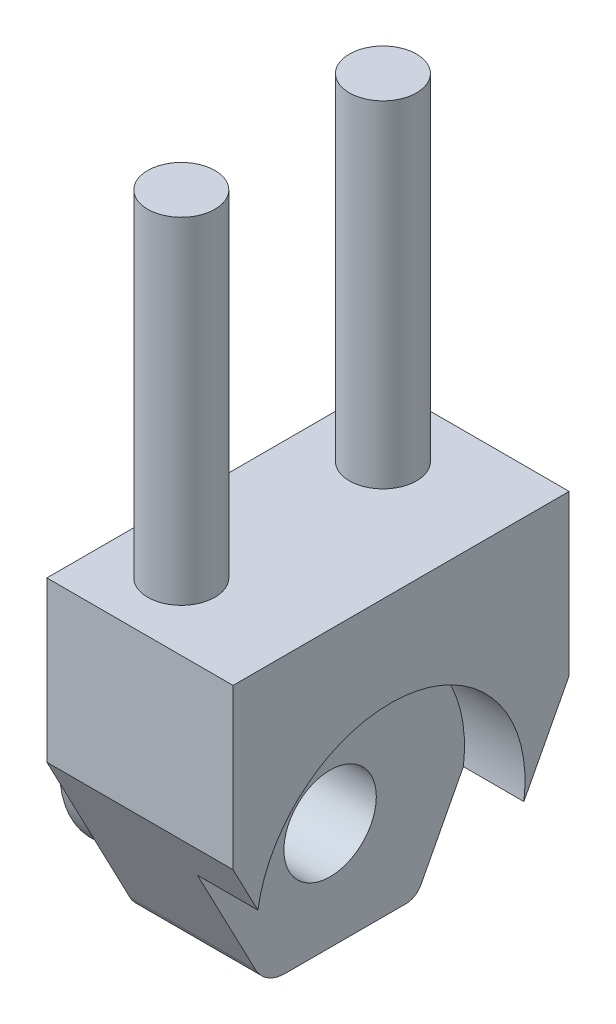
ISO-10303-21;
HEADER;
FILE_DESCRIPTION(('STEP AP214'),'2;1');
FILE_NAME('part.step','',(''),(''),'','','');
FILE_SCHEMA(('AUTOMOTIVE_DESIGN { 1 0 10303 214 1 1 1 1 }'));
ENDSEC;
DATA;
#1=APPLICATION_CONTEXT('core data for automotive mechanical design processes');
#2=APPLICATION_PROTOCOL_DEFINITION('international standard','automotive_design',2000,#1);
#3=PRODUCT_CONTEXT('',#1,'mechanical');
#4=PRODUCT('Part','Part','',(#3));
#5=PRODUCT_RELATED_PRODUCT_CATEGORY('part','',(#4));
#6=PRODUCT_DEFINITION_FORMATION('','',#4);
#7=PRODUCT_DEFINITION_CONTEXT('part definition',#1,'design');
#8=PRODUCT_DEFINITION('design','',#6,#7);
#9=PRODUCT_DEFINITION_SHAPE('','',#8);
#10=(LENGTH_UNIT() NAMED_UNIT(*) SI_UNIT(.MILLI.,.METRE.));
#11=(NAMED_UNIT(*) PLANE_ANGLE_UNIT() SI_UNIT($,.RADIAN.));
#12=(NAMED_UNIT(*) SI_UNIT($,.STERADIAN.) SOLID_ANGLE_UNIT());
#13=UNCERTAINTY_MEASURE_WITH_UNIT(LENGTH_MEASURE(1.E-05),#10,'distance_accuracy_value','');
#14=(GEOMETRIC_REPRESENTATION_CONTEXT(3) GLOBAL_UNCERTAINTY_ASSIGNED_CONTEXT((#13)) GLOBAL_UNIT_ASSIGNED_CONTEXT((#10,
#11,#12)) REPRESENTATION_CONTEXT('',''));
#15=CARTESIAN_POINT('',(0.,0.,0.));
#16=DIRECTION('',(0.,0.,1.));
#17=DIRECTION('',(1.,0.,0.));
#18=AXIS2_PLACEMENT_3D('',#15,#16,#17);
#19=CARTESIAN_POINT('',(30.7741068663053,12.8,1.61793004647283));
#20=DIRECTION('',(1.,0.,0.));
#21=DIRECTION('',(0.,0.,-1.));
#22=AXIS2_PLACEMENT_3D('',#19,#20,#21);
#23=PLANE('',#22);
#24=DIRECTION('',(0.,0.,-1.));
#25=VECTOR('',#24,1.);
#26=CARTESIAN_POINT('',(30.7741068663053,0.,0.));
#27=LINE('',#26,#25);
#28=CARTESIAN_POINT('',(30.7741068663053,0.,6.94763686889959));
#29=VERTEX_POINT('',#28);
#30=CARTESIAN_POINT('',(30.7741068663053,0.,-7.42192336474054));
#31=VERTEX_POINT('',#30);
#32=EDGE_CURVE('E177',#29,#31,#27,.T.);
#33=ORIENTED_EDGE('',*,*,#32,.T.);
#34=CARTESIAN_POINT('',(30.7741068663053,2.,-7.42192336474054));
#35=DIRECTION('',(1.,0.,0.));
#36=DIRECTION('',(0.,0.,-1.));
#37=AXIS2_PLACEMENT_3D('',#34,#35,#36);
#38=CIRCLE('',#37,2.);
#39=CARTESIAN_POINT('',(30.7741068663053,1.07198601065888,-9.19358643530085));
#40=VERTEX_POINT('',#39);
#41=EDGE_CURVE('E58',#31,#40,#38,.T.);
#42=ORIENTED_EDGE('',*,*,#41,.T.);
#43=DIRECTION('',(0.,0.885831535280156,-0.464006994670556));
#44=VECTOR('',#43,1.);
#45=CARTESIAN_POINT('',(30.7741068663053,21.0000000000001,-19.6320699535272));
#46=LINE('',#45,#44);
#47=CARTESIAN_POINT('',(30.7741068663053,10.7174168179879,-14.2459549534255));
#48=VERTEX_POINT('',#47);
#49=EDGE_CURVE('E132',#48,#40,#46,.F.);
#50=ORIENTED_EDGE('',*,*,#49,.F.);
#51=CARTESIAN_POINT('',(30.7741068663053,12.8,1.61793004647283));
#52=DIRECTION('',(1.,0.,0.));
#53=DIRECTION('',(0.,0.,-1.));
#54=AXIS2_PLACEMENT_3D('',#51,#52,#53);
#55=CIRCLE('',#54,16.);
#56=CARTESIAN_POINT('',(30.7741068663053,15.3573140445786,17.4122374031568));
#57=VERTEX_POINT('',#56);
#58=EDGE_CURVE('E121',#48,#57,#55,.T.);
#59=ORIENTED_EDGE('',*,*,#58,.T.);
#60=DIRECTION('',(0.,-0.885831535280157,-0.464006994670556));
#61=VECTOR('',#60,1.);
#62=CARTESIAN_POINT('',(30.7741068663053,21.0000000000001,20.3679300464728));
#63=LINE('',#62,#61);
#64=CARTESIAN_POINT('',(30.7741068663053,2.14397202131778,10.4909630100202));
#65=VERTEX_POINT('',#64);
#66=EDGE_CURVE('E130',#65,#57,#63,.F.);
#67=ORIENTED_EDGE('',*,*,#66,.F.);
#68=CARTESIAN_POINT('',(30.7741068663053,4.,6.94763686889959));
#69=DIRECTION('',(1.,0.,0.));
#70=DIRECTION('',(0.,0.,-1.));
#71=AXIS2_PLACEMENT_3D('',#68,#69,#70);
#72=CIRCLE('',#71,4.);
#73=EDGE_CURVE('E164',#29,#65,#72,.F.);
#74=ORIENTED_EDGE('',*,*,#73,.F.);
#75=EDGE_LOOP('',(#33,#42,#50,#59,#67,#74));
#76=FACE_BOUND('',#75,.T.);
#77=CARTESIAN_POINT('',(30.7741068663053,12.8,1.61793004647283));
#78=DIRECTION('',(1.,0.,0.));
#79=DIRECTION('',(0.,0.,-1.));
#80=AXIS2_PLACEMENT_3D('',#77,#78,#79);
#81=CIRCLE('',#80,5.5);
#82=CARTESIAN_POINT('',(30.7741068663053,12.8,-3.88206995352717));
#83=VERTEX_POINT('',#82);
#84=EDGE_CURVE('E39',#83,#83,#81,.F.);
#85=ORIENTED_EDGE('',*,*,#84,.T.);
#86=EDGE_LOOP('',(#85));
#87=FACE_BOUND('',#86,.T.);
#88=ADVANCED_FACE('F35',(#76,#87),#23,.T.);
#89=CARTESIAN_POINT('',(0.,0.,0.));
#90=DIRECTION('',(0.,1.,0.));
#91=DIRECTION('',(0.,0.,1.));
#92=AXIS2_PLACEMENT_3D('',#89,#90,#91);
#93=PLANE('',#92);
#94=DIRECTION('',(0.,0.,1.));
#95=VECTOR('',#94,1.);
#96=CARTESIAN_POINT('',(15.8141068663053,0.,-19.6320699535272));
#97=LINE('',#96,#95);
#98=CARTESIAN_POINT('',(15.8141068663053,0.,-7.42192336474054));
#99=VERTEX_POINT('',#98);
#100=CARTESIAN_POINT('',(15.8141068663053,0.,6.94763686889959));
#101=VERTEX_POINT('',#100);
#102=EDGE_CURVE('E179',#99,#101,#97,.T.);
#103=ORIENTED_EDGE('',*,*,#102,.F.);
#104=DIRECTION('',(-1.,0.,0.));
#105=VECTOR('',#104,1.);
#106=CARTESIAN_POINT('',(30.7741068663053,0.,-7.42192336474054));
#107=LINE('',#106,#105);
#108=EDGE_CURVE('E168',#99,#31,#107,.F.);
#109=ORIENTED_EDGE('',*,*,#108,.T.);
#110=ORIENTED_EDGE('',*,*,#32,.F.);
#111=DIRECTION('',(1.,0.,0.));
#112=VECTOR('',#111,1.);
#113=CARTESIAN_POINT('',(15.8141068663053,0.,6.94763686889959));
#114=LINE('',#113,#112);
#115=EDGE_CURVE('E154',#29,#101,#114,.F.);
#116=ORIENTED_EDGE('',*,*,#115,.T.);
#117=EDGE_LOOP('',(#103,#109,#110,#116));
#118=FACE_BOUND('',#117,.T.);
#119=ADVANCED_FACE('F176',(#118),#93,.F.);
#120=CARTESIAN_POINT('',(15.8141068663053,21.0000000000001,-19.6320699535272));
#121=DIRECTION('',(0.,0.464006994670556,0.885831535280156));
#122=DIRECTION('',(-1.,0.,0.));
#123=AXIS2_PLACEMENT_3D('',#120,#121,#122);
#124=PLANE('',#123);
#125=ORIENTED_EDGE('',*,*,#49,.T.);
#126=DIRECTION('',(1.,0.,0.));
#127=VECTOR('',#126,1.);
#128=CARTESIAN_POINT('',(15.8141068663053,1.07198601065889,-9.19358643530085));
#129=LINE('',#128,#127);
#130=CARTESIAN_POINT('',(15.8141068663053,1.07198601065888,-9.19358643530085));
#131=VERTEX_POINT('',#130);
#132=EDGE_CURVE('E44',#40,#131,#129,.F.);
#133=ORIENTED_EDGE('',*,*,#132,.T.);
#134=DIRECTION('',(0.,0.885831535280156,-0.464006994670556));
#135=VECTOR('',#134,1.);
#136=CARTESIAN_POINT('',(15.8141068663053,21.0000000000001,-19.6320699535272));
#137=LINE('',#136,#135);
#138=CARTESIAN_POINT('',(15.8141068663053,21.0000000000001,-19.6320699535272));
#139=VERTEX_POINT('',#138);
#140=EDGE_CURVE('E150',#139,#131,#137,.F.);
#141=ORIENTED_EDGE('',*,*,#140,.F.);
#142=DIRECTION('',(-1.,0.,0.));
#143=VECTOR('',#142,1.);
#144=CARTESIAN_POINT('',(15.8141068663053,21.0000000000001,-19.6320699535272));
#145=LINE('',#144,#143);
#146=CARTESIAN_POINT('',(37.9741068663053,21.0000000000001,-19.6320699535272));
#147=VERTEX_POINT('',#146);
#148=EDGE_CURVE('E142',#147,#139,#145,.T.);
#149=ORIENTED_EDGE('',*,*,#148,.F.);
#150=DIRECTION('',(0.,-0.885831535280156,0.464006994670556));
#151=VECTOR('',#150,1.);
#152=CARTESIAN_POINT('',(37.9741068663053,21.0000000000001,-19.6320699535272));
#153=LINE('',#152,#151);
#154=CARTESIAN_POINT('',(37.9741068663053,10.7174168179879,-14.2459549534255));
#155=VERTEX_POINT('',#154);
#156=EDGE_CURVE('E152',#155,#147,#153,.F.);
#157=ORIENTED_EDGE('',*,*,#156,.F.);
#158=DIRECTION('',(1.,0.,0.));
#159=VECTOR('',#158,1.);
#160=CARTESIAN_POINT('',(30.7741068663053,10.7174168179879,-14.2459549534255));
#161=LINE('',#160,#159);
#162=EDGE_CURVE('E117',#48,#155,#161,.T.);
#163=ORIENTED_EDGE('',*,*,#162,.F.);
#164=EDGE_LOOP('',(#125,#133,#141,#149,#157,#163));
#165=FACE_BOUND('',#164,.T.);
#166=ADVANCED_FACE('F246',(#165),#124,.F.);
#167=CARTESIAN_POINT('',(37.9741068663053,40.,-19.6320699535272));
#168=DIRECTION('',(-1.,0.,0.));
#169=DIRECTION('',(0.,0.,1.));
#170=AXIS2_PLACEMENT_3D('',#167,#168,#169);
#171=PLANE('',#170);
#172=DIRECTION('',(0.,0.885831535280157,0.464006994670556));
#173=VECTOR('',#172,1.);
#174=CARTESIAN_POINT('',(37.9741068663053,21.0000000000001,20.3679300464728));
#175=LINE('',#174,#173);
#176=CARTESIAN_POINT('',(37.9741068663053,21.0000000000002,20.3679300464728));
#177=VERTEX_POINT('',#176);
#178=CARTESIAN_POINT('',(37.9741068663053,15.3573140445786,17.4122374031568));
#179=VERTEX_POINT('',#178);
#180=EDGE_CURVE('E127',#177,#179,#175,.F.);
#181=ORIENTED_EDGE('',*,*,#180,.T.);
#182=CARTESIAN_POINT('',(37.9741068663053,12.8,1.61793004647283));
#183=DIRECTION('',(1.,0.,0.));
#184=DIRECTION('',(0.,0.,-1.));
#185=AXIS2_PLACEMENT_3D('',#182,#183,#184);
#186=CIRCLE('',#185,16.);
#187=EDGE_CURVE('E110',#155,#179,#186,.T.);
#188=ORIENTED_EDGE('',*,*,#187,.F.);
#189=ORIENTED_EDGE('',*,*,#156,.T.);
#190=DIRECTION('',(0.,-1.,0.));
#191=VECTOR('',#190,1.);
#192=CARTESIAN_POINT('',(37.9741068663053,40.,-19.6320699535272));
#193=LINE('',#192,#191);
#194=CARTESIAN_POINT('',(37.9741068663053,40.,-19.6320699535272));
#195=VERTEX_POINT('',#194);
#196=EDGE_CURVE('E214',#195,#147,#193,.T.);
#197=ORIENTED_EDGE('',*,*,#196,.F.);
#198=DIRECTION('',(0.,0.,-1.));
#199=VECTOR('',#198,1.);
#200=CARTESIAN_POINT('',(37.9741068663053,40.,-19.6320699535272));
#201=LINE('',#200,#199);
#202=CARTESIAN_POINT('',(37.9741068663053,40.,20.3679300464728));
#203=VERTEX_POINT('',#202);
#204=EDGE_CURVE('E206',#203,#195,#201,.T.);
#205=ORIENTED_EDGE('',*,*,#204,.F.);
#206=DIRECTION('',(0.,-1.,0.));
#207=VECTOR('',#206,1.);
#208=CARTESIAN_POINT('',(37.9741068663053,40.,20.3679300464728));
#209=LINE('',#208,#207);
#210=EDGE_CURVE('E138',#203,#177,#209,.T.);
#211=ORIENTED_EDGE('',*,*,#210,.T.);
#212=EDGE_LOOP('',(#181,#188,#189,#197,#205,#211));
#213=FACE_BOUND('',#212,.T.);
#214=ADVANCED_FACE('F135',(#213),#171,.F.);
#215=CARTESIAN_POINT('',(0.,4.,6.94763686889959));
#216=DIRECTION('',(-1.,0.,0.));
#217=DIRECTION('',(0.,0.,1.));
#218=AXIS2_PLACEMENT_3D('',#215,#216,#217);
#219=CYLINDRICAL_SURFACE('',#218,4.);
#220=ORIENTED_EDGE('',*,*,#115,.F.);
#221=ORIENTED_EDGE('',*,*,#73,.T.);
#222=DIRECTION('',(-1.,0.,0.));
#223=VECTOR('',#222,1.);
#224=CARTESIAN_POINT('',(37.9741068663053,2.14397202131778,10.4909630100202));
#225=LINE('',#224,#223);
#226=CARTESIAN_POINT('',(15.8141068663053,2.14397202131777,10.4909630100202));
#227=VERTEX_POINT('',#226);
#228=EDGE_CURVE('E159',#227,#65,#225,.F.);
#229=ORIENTED_EDGE('',*,*,#228,.F.);
#230=CARTESIAN_POINT('',(15.8141068663053,4.,6.94763686889959));
#231=DIRECTION('',(1.,0.,0.));
#232=DIRECTION('',(0.,0.,-1.));
#233=AXIS2_PLACEMENT_3D('',#230,#231,#232);
#234=CIRCLE('',#233,4.);
#235=EDGE_CURVE('E157',#101,#227,#234,.F.);
#236=ORIENTED_EDGE('',*,*,#235,.F.);
#237=EDGE_LOOP('',(#220,#221,#229,#236));
#238=FACE_BOUND('',#237,.T.);
#239=ADVANCED_FACE('F227',(#238),#219,.T.);
#240=CARTESIAN_POINT('',(15.8141068663053,40.,-19.6320699535272));
#241=DIRECTION('',(1.,0.,0.));
#242=DIRECTION('',(0.,0.,-1.));
#243=AXIS2_PLACEMENT_3D('',#240,#241,#242);
#244=PLANE('',#243);
#245=ORIENTED_EDGE('',*,*,#140,.T.);
#246=CARTESIAN_POINT('',(15.8141068663053,2.,-7.42192336474054));
#247=DIRECTION('',(1.,0.,0.));
#248=DIRECTION('',(0.,0.,-1.));
#249=AXIS2_PLACEMENT_3D('',#246,#247,#248);
#250=CIRCLE('',#249,2.);
#251=EDGE_CURVE('E11',#131,#99,#250,.F.);
#252=ORIENTED_EDGE('',*,*,#251,.T.);
#253=ORIENTED_EDGE('',*,*,#102,.T.);
#254=ORIENTED_EDGE('',*,*,#235,.T.);
#255=DIRECTION('',(0.,-0.885831535280157,-0.464006994670556));
#256=VECTOR('',#255,1.);
#257=CARTESIAN_POINT('',(15.8141068663053,21.0000000000001,20.3679300464728));
#258=LINE('',#257,#256);
#259=CARTESIAN_POINT('',(15.8141068663053,21.0000000000002,20.3679300464728));
#260=VERTEX_POINT('',#259);
#261=EDGE_CURVE('E139',#227,#260,#258,.F.);
#262=ORIENTED_EDGE('',*,*,#261,.T.);
#263=DIRECTION('',(0.,-1.,0.));
#264=VECTOR('',#263,1.);
#265=CARTESIAN_POINT('',(15.8141068663053,40.,20.3679300464728));
#266=LINE('',#265,#264);
#267=CARTESIAN_POINT('',(15.8141068663053,40.,20.3679300464728));
#268=VERTEX_POINT('',#267);
#269=EDGE_CURVE('E144',#268,#260,#266,.T.);
#270=ORIENTED_EDGE('',*,*,#269,.F.);
#271=DIRECTION('',(0.,0.,1.));
#272=VECTOR('',#271,1.);
#273=CARTESIAN_POINT('',(15.8141068663053,40.,-19.6320699535272));
#274=LINE('',#273,#272);
#275=CARTESIAN_POINT('',(15.8141068663053,40.,-19.6320699535272));
#276=VERTEX_POINT('',#275);
#277=EDGE_CURVE('E201',#276,#268,#274,.T.);
#278=ORIENTED_EDGE('',*,*,#277,.F.);
#279=DIRECTION('',(0.,-1.,0.));
#280=VECTOR('',#279,1.);
#281=CARTESIAN_POINT('',(15.8141068663053,40.,-19.6320699535272));
#282=LINE('',#281,#280);
#283=EDGE_CURVE('E210',#276,#139,#282,.T.);
#284=ORIENTED_EDGE('',*,*,#283,.T.);
#285=EDGE_LOOP('',(#245,#252,#253,#254,#262,#270,#278,#284));
#286=FACE_BOUND('',#285,.T.);
#287=CARTESIAN_POINT('',(15.8141068663053,13.5,0.367930046472834));
#288=DIRECTION('',(1.,0.,0.));
#289=DIRECTION('',(0.,0.,-1.));
#290=AXIS2_PLACEMENT_3D('',#287,#288,#289);
#291=CIRCLE('',#290,12.5);
#292=CARTESIAN_POINT('',(15.8141068663053,13.5,-12.1320699535272));
#293=VERTEX_POINT('',#292);
#294=EDGE_CURVE('E161',#293,#293,#291,.F.);
#295=ORIENTED_EDGE('',*,*,#294,.F.);
#296=EDGE_LOOP('',(#295));
#297=FACE_BOUND('',#296,.T.);
#298=ADVANCED_FACE('F228',(#286,#297),#244,.F.);
#299=CARTESIAN_POINT('',(0.,40.,0.));
#300=DIRECTION('',(0.,1.,0.));
#301=DIRECTION('',(0.,0.,1.));
#302=AXIS2_PLACEMENT_3D('',#299,#300,#301);
#303=PLANE('',#302);
#304=CARTESIAN_POINT('',(23.8141068663053,40.,-11.6320699535272));
#305=DIRECTION('',(0.,1.,0.));
#306=DIRECTION('',(0.,0.,1.));
#307=AXIS2_PLACEMENT_3D('',#304,#305,#306);
#308=CIRCLE('',#307,4.);
#309=CARTESIAN_POINT('',(23.8141068663053,40.,-7.63206995352717));
#310=VERTEX_POINT('',#309);
#311=EDGE_CURVE('E193',#310,#310,#308,.T.);
#312=ORIENTED_EDGE('',*,*,#311,.F.);
#313=EDGE_LOOP('',(#312));
#314=FACE_BOUND('',#313,.T.);
#315=ORIENTED_EDGE('',*,*,#277,.T.);
#316=DIRECTION('',(1.,0.,0.));
#317=VECTOR('',#316,1.);
#318=CARTESIAN_POINT('',(15.8141068663053,40.,20.3679300464728));
#319=LINE('',#318,#317);
#320=EDGE_CURVE('E204',#268,#203,#319,.T.);
#321=ORIENTED_EDGE('',*,*,#320,.T.);
#322=ORIENTED_EDGE('',*,*,#204,.T.);
#323=DIRECTION('',(-1.,0.,0.));
#324=VECTOR('',#323,1.);
#325=CARTESIAN_POINT('',(15.8141068663053,40.,-19.6320699535272));
#326=LINE('',#325,#324);
#327=EDGE_CURVE('E208',#195,#276,#326,.T.);
#328=ORIENTED_EDGE('',*,*,#327,.T.);
#329=EDGE_LOOP('',(#315,#321,#322,#328));
#330=FACE_BOUND('',#329,.T.);
#331=CARTESIAN_POINT('',(23.8141068663053,40.,12.3679300464728));
#332=DIRECTION('',(0.,1.,0.));
#333=DIRECTION('',(0.,0.,1.));
#334=AXIS2_PLACEMENT_3D('',#331,#332,#333);
#335=CIRCLE('',#334,4.);
#336=CARTESIAN_POINT('',(23.8141068663053,40.,16.3679300464728));
#337=VERTEX_POINT('',#336);
#338=EDGE_CURVE('E189',#337,#337,#335,.T.);
#339=ORIENTED_EDGE('',*,*,#338,.F.);
#340=EDGE_LOOP('',(#339));
#341=FACE_BOUND('',#340,.T.);
#342=ADVANCED_FACE('F273',(#314,#330,#341),#303,.T.);
#343=CARTESIAN_POINT('',(15.8141068663053,40.,20.3679300464728));
#344=DIRECTION('',(0.,0.,-1.));
#345=DIRECTION('',(-1.,0.,0.));
#346=AXIS2_PLACEMENT_3D('',#343,#344,#345);
#347=PLANE('',#346);
#348=ORIENTED_EDGE('',*,*,#269,.T.);
#349=DIRECTION('',(1.,0.,0.));
#350=VECTOR('',#349,1.);
#351=CARTESIAN_POINT('',(15.8141068663053,21.0000000000001,20.3679300464728));
#352=LINE('',#351,#350);
#353=EDGE_CURVE('E140',#260,#177,#352,.T.);
#354=ORIENTED_EDGE('',*,*,#353,.T.);
#355=ORIENTED_EDGE('',*,*,#210,.F.);
#356=ORIENTED_EDGE('',*,*,#320,.F.);
#357=EDGE_LOOP('',(#348,#354,#355,#356));
#358=FACE_BOUND('',#357,.T.);
#359=ADVANCED_FACE('F220',(#358),#347,.F.);
#360=CARTESIAN_POINT('',(15.8141068663053,40.,-19.6320699535272));
#361=DIRECTION('',(0.,0.,1.));
#362=DIRECTION('',(1.,0.,0.));
#363=AXIS2_PLACEMENT_3D('',#360,#361,#362);
#364=PLANE('',#363);
#365=ORIENTED_EDGE('',*,*,#196,.T.);
#366=ORIENTED_EDGE('',*,*,#148,.T.);
#367=ORIENTED_EDGE('',*,*,#283,.F.);
#368=ORIENTED_EDGE('',*,*,#327,.F.);
#369=EDGE_LOOP('',(#365,#366,#367,#368));
#370=FACE_BOUND('',#369,.T.);
#371=ADVANCED_FACE('F277',(#370),#364,.F.);
#372=CARTESIAN_POINT('',(15.8141068663053,21.0000000000001,20.3679300464728));
#373=DIRECTION('',(0.,0.464006994670556,-0.885831535280156));
#374=DIRECTION('',(1.,0.,0.));
#375=AXIS2_PLACEMENT_3D('',#372,#373,#374);
#376=PLANE('',#375);
#377=DIRECTION('',(1.,0.,0.));
#378=VECTOR('',#377,1.);
#379=CARTESIAN_POINT('',(30.7741068663053,15.3573140445786,17.4122374031568));
#380=LINE('',#379,#378);
#381=EDGE_CURVE('E114',#179,#57,#380,.F.);
#382=ORIENTED_EDGE('',*,*,#381,.F.);
#383=ORIENTED_EDGE('',*,*,#180,.F.);
#384=ORIENTED_EDGE('',*,*,#353,.F.);
#385=ORIENTED_EDGE('',*,*,#261,.F.);
#386=ORIENTED_EDGE('',*,*,#228,.T.);
#387=ORIENTED_EDGE('',*,*,#66,.T.);
#388=EDGE_LOOP('',(#382,#383,#384,#385,#386,#387));
#389=FACE_BOUND('',#388,.T.);
#390=ADVANCED_FACE('F125',(#389),#376,.F.);
#391=CARTESIAN_POINT('',(23.8141068663053,80.,-11.6320699535272));
#392=DIRECTION('',(0.,-1.,0.));
#393=DIRECTION('',(0.,0.,-1.));
#394=AXIS2_PLACEMENT_3D('',#391,#392,#393);
#395=CYLINDRICAL_SURFACE('',#394,4.);
#396=CARTESIAN_POINT('',(23.8141068663053,80.,-11.6320699535272));
#397=DIRECTION('',(0.,1.,0.));
#398=DIRECTION('',(0.,0.,1.));
#399=AXIS2_PLACEMENT_3D('',#396,#397,#398);
#400=CIRCLE('',#399,4.);
#401=CARTESIAN_POINT('',(23.8141068663053,80.,-7.63206995352717));
#402=VERTEX_POINT('',#401);
#403=EDGE_CURVE('E196',#402,#402,#400,.T.);
#404=ORIENTED_EDGE('',*,*,#403,.F.);
#405=EDGE_LOOP('',(#404));
#406=FACE_BOUND('',#405,.T.);
#407=ORIENTED_EDGE('',*,*,#311,.T.);
#408=EDGE_LOOP('',(#407));
#409=FACE_BOUND('',#408,.T.);
#410=ADVANCED_FACE('F268',(#406,#409),#395,.T.);
#411=CARTESIAN_POINT('',(23.8141068663053,80.,-11.6320699535272));
#412=DIRECTION('',(0.,1.,0.));
#413=DIRECTION('',(0.,0.,1.));
#414=AXIS2_PLACEMENT_3D('',#411,#412,#413);
#415=PLANE('',#414);
#416=ORIENTED_EDGE('',*,*,#403,.T.);
#417=EDGE_LOOP('',(#416));
#418=FACE_BOUND('',#417,.T.);
#419=ADVANCED_FACE('F264',(#418),#415,.T.);
#420=CARTESIAN_POINT('',(23.8141068663053,80.,12.3679300464728));
#421=DIRECTION('',(0.,-1.,0.));
#422=DIRECTION('',(0.,0.,-1.));
#423=AXIS2_PLACEMENT_3D('',#420,#421,#422);
#424=CYLINDRICAL_SURFACE('',#423,4.);
#425=CARTESIAN_POINT('',(23.8141068663053,80.,12.3679300464728));
#426=DIRECTION('',(0.,1.,0.));
#427=DIRECTION('',(0.,0.,1.));
#428=AXIS2_PLACEMENT_3D('',#425,#426,#427);
#429=CIRCLE('',#428,4.);
#430=CARTESIAN_POINT('',(23.8141068663053,80.,16.3679300464728));
#431=VERTEX_POINT('',#430);
#432=EDGE_CURVE('E190',#431,#431,#429,.T.);
#433=ORIENTED_EDGE('',*,*,#432,.F.);
#434=EDGE_LOOP('',(#433));
#435=FACE_BOUND('',#434,.T.);
#436=ORIENTED_EDGE('',*,*,#338,.T.);
#437=EDGE_LOOP('',(#436));
#438=FACE_BOUND('',#437,.T.);
#439=ADVANCED_FACE('F260',(#435,#438),#424,.T.);
#440=CARTESIAN_POINT('',(23.8141068663053,80.,12.3679300464728));
#441=DIRECTION('',(0.,1.,0.));
#442=DIRECTION('',(0.,0.,1.));
#443=AXIS2_PLACEMENT_3D('',#440,#441,#442);
#444=PLANE('',#443);
#445=ORIENTED_EDGE('',*,*,#432,.T.);
#446=EDGE_LOOP('',(#445));
#447=FACE_BOUND('',#446,.T.);
#448=ADVANCED_FACE('F256',(#447),#444,.T.);
#449=CARTESIAN_POINT('',(9.81410686630526,13.5,0.367930046472835));
#450=DIRECTION('',(1.,0.,0.));
#451=DIRECTION('',(0.,0.,-1.));
#452=AXIS2_PLACEMENT_3D('',#449,#450,#451);
#453=CYLINDRICAL_SURFACE('',#452,12.5);
#454=CARTESIAN_POINT('',(9.81410686630526,13.5,0.367930046472835));
#455=DIRECTION('',(-1.,0.,0.));
#456=DIRECTION('',(0.,0.,1.));
#457=AXIS2_PLACEMENT_3D('',#454,#455,#456);
#458=CIRCLE('',#457,12.5);
#459=CARTESIAN_POINT('',(9.81410686630526,13.5,12.8679300464728));
#460=VERTEX_POINT('',#459);
#461=EDGE_CURVE('E131',#460,#460,#458,.T.);
#462=ORIENTED_EDGE('',*,*,#461,.F.);
#463=EDGE_LOOP('',(#462));
#464=FACE_BOUND('',#463,.T.);
#465=ORIENTED_EDGE('',*,*,#294,.T.);
#466=EDGE_LOOP('',(#465));
#467=FACE_BOUND('',#466,.T.);
#468=ADVANCED_FACE('F252',(#464,#467),#453,.T.);
#469=CARTESIAN_POINT('',(9.81410686630526,13.5,0.367930046472835));
#470=DIRECTION('',(-1.,0.,0.));
#471=DIRECTION('',(0.,0.,1.));
#472=AXIS2_PLACEMENT_3D('',#469,#470,#471);
#473=PLANE('',#472);
#474=ORIENTED_EDGE('',*,*,#461,.T.);
#475=EDGE_LOOP('',(#474));
#476=FACE_BOUND('',#475,.T.);
#477=ADVANCED_FACE('F239',(#476),#473,.T.);
#478=CARTESIAN_POINT('',(30.7741068663053,12.8,1.61793004647283));
#479=DIRECTION('',(1.,0.,0.));
#480=DIRECTION('',(0.,0.,-1.));
#481=AXIS2_PLACEMENT_3D('',#478,#479,#480);
#482=CYLINDRICAL_SURFACE('',#481,16.);
#483=ORIENTED_EDGE('',*,*,#381,.T.);
#484=ORIENTED_EDGE('',*,*,#58,.F.);
#485=ORIENTED_EDGE('',*,*,#162,.T.);
#486=ORIENTED_EDGE('',*,*,#187,.T.);
#487=EDGE_LOOP('',(#483,#484,#485,#486));
#488=FACE_BOUND('',#487,.T.);
#489=ADVANCED_FACE('F112',(#488),#482,.F.);
#490=CARTESIAN_POINT('',(0.,2.,-7.42192336474054));
#491=DIRECTION('',(1.,0.,0.));
#492=DIRECTION('',(0.,0.,-1.));
#493=AXIS2_PLACEMENT_3D('',#490,#491,#492);
#494=CYLINDRICAL_SURFACE('',#493,2.);
#495=ORIENTED_EDGE('',*,*,#251,.F.);
#496=ORIENTED_EDGE('',*,*,#132,.F.);
#497=ORIENTED_EDGE('',*,*,#41,.F.);
#498=ORIENTED_EDGE('',*,*,#108,.F.);
#499=EDGE_LOOP('',(#495,#496,#497,#498));
#500=FACE_BOUND('',#499,.T.);
#501=ADVANCED_FACE('F37',(#500),#494,.T.);
#502=CARTESIAN_POINT('',(22.9741068663053,12.8,1.61793004647283));
#503=DIRECTION('',(1.,0.,0.));
#504=DIRECTION('',(0.,0.,-1.));
#505=AXIS2_PLACEMENT_3D('',#502,#503,#504);
#506=CYLINDRICAL_SURFACE('',#505,5.5);
#507=ORIENTED_EDGE('',*,*,#84,.F.);
#508=EDGE_LOOP('',(#507));
#509=FACE_BOUND('',#508,.T.);
#510=CARTESIAN_POINT('',(22.9741068663053,12.8,1.61793004647283));
#511=DIRECTION('',(-1.,0.,0.));
#512=DIRECTION('',(0.,0.,1.));
#513=AXIS2_PLACEMENT_3D('',#510,#511,#512);
#514=CIRCLE('',#513,5.5);
#515=CARTESIAN_POINT('',(22.9741068663053,12.8,7.11793004647283));
#516=VERTEX_POINT('',#515);
#517=EDGE_CURVE('E387',#516,#516,#514,.T.);
#518=ORIENTED_EDGE('',*,*,#517,.T.);
#519=EDGE_LOOP('',(#518));
#520=FACE_BOUND('',#519,.T.);
#521=ADVANCED_FACE('F231',(#509,#520),#506,.F.);
#522=CARTESIAN_POINT('',(22.9741068663053,12.8,1.61793004647283));
#523=DIRECTION('',(-1.,0.,0.));
#524=DIRECTION('',(0.,0.,1.));
#525=AXIS2_PLACEMENT_3D('',#522,#523,#524);
#526=PLANE('',#525);
#527=ORIENTED_EDGE('',*,*,#517,.F.);
#528=EDGE_LOOP('',(#527));
#529=FACE_BOUND('',#528,.T.);
#530=ADVANCED_FACE('F236',(#529),#526,.F.);
#531=CLOSED_SHELL('',(#88,#119,#166,#214,#239,#298,#342,#359,#371,#390,#410,#419,#439,#448,#468,
#477,#489,#501,#521,#530));
#532=MANIFOLD_SOLID_BREP('B2',#531);
#533=ADVANCED_BREP_SHAPE_REPRESENTATION('',(#18,#532),#14);
#534=SHAPE_DEFINITION_REPRESENTATION(#9,#533);
ENDSEC;
END-ISO-10303-21;
